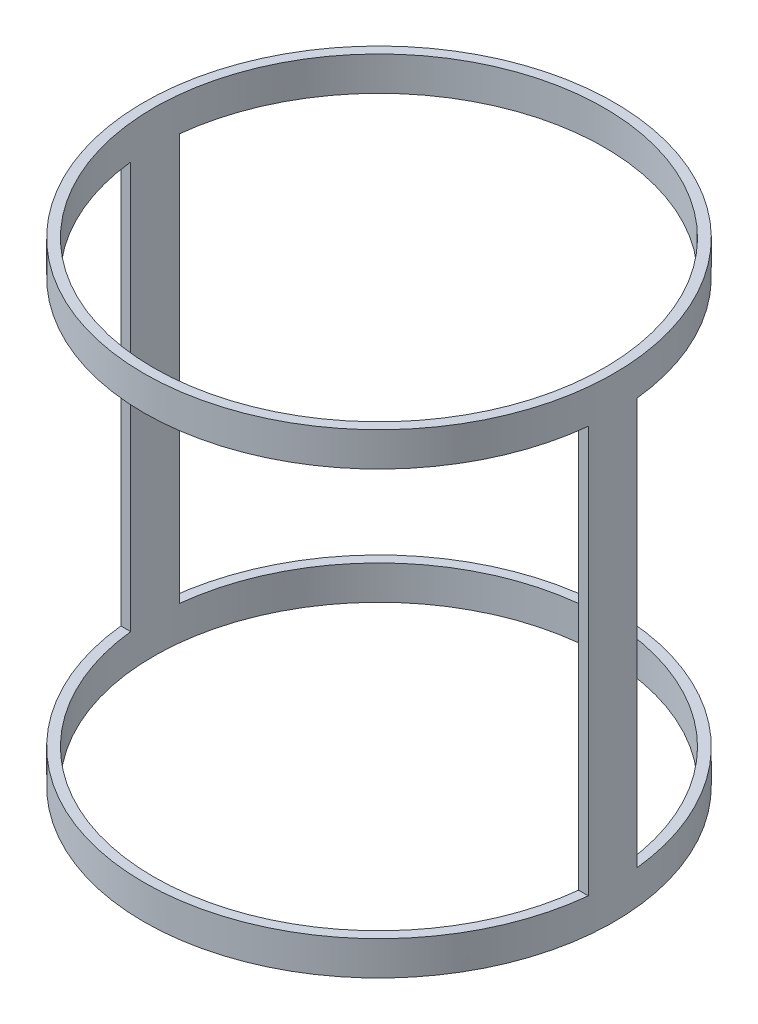
ISO-10303-21;
HEADER;
FILE_DESCRIPTION(('STEP AP214'),'2;1');
FILE_NAME('part.step','',(''),(''),'','','');
FILE_SCHEMA(('AUTOMOTIVE_DESIGN { 1 0 10303 214 1 1 1 1 }'));
ENDSEC;
DATA;
#1=APPLICATION_CONTEXT('core data for automotive mechanical design processes');
#2=APPLICATION_PROTOCOL_DEFINITION('international standard','automotive_design',2000,#1);
#3=PRODUCT_CONTEXT('',#1,'mechanical');
#4=PRODUCT('Part','Part','',(#3));
#5=PRODUCT_RELATED_PRODUCT_CATEGORY('part','',(#4));
#6=PRODUCT_DEFINITION_FORMATION('','',#4);
#7=PRODUCT_DEFINITION_CONTEXT('part definition',#1,'design');
#8=PRODUCT_DEFINITION('design','',#6,#7);
#9=PRODUCT_DEFINITION_SHAPE('','',#8);
#10=(LENGTH_UNIT() NAMED_UNIT(*) SI_UNIT(.MILLI.,.METRE.));
#11=(NAMED_UNIT(*) PLANE_ANGLE_UNIT() SI_UNIT($,.RADIAN.));
#12=(NAMED_UNIT(*) SI_UNIT($,.STERADIAN.) SOLID_ANGLE_UNIT());
#13=UNCERTAINTY_MEASURE_WITH_UNIT(LENGTH_MEASURE(1.E-05),#10,'distance_accuracy_value','');
#14=(GEOMETRIC_REPRESENTATION_CONTEXT(3) GLOBAL_UNCERTAINTY_ASSIGNED_CONTEXT((#13)) GLOBAL_UNIT_ASSIGNED_CONTEXT((#10,
#11,#12)) REPRESENTATION_CONTEXT('',''));
#15=CARTESIAN_POINT('',(0.,0.,0.));
#16=DIRECTION('',(0.,0.,1.));
#17=DIRECTION('',(1.,0.,0.));
#18=AXIS2_PLACEMENT_3D('',#15,#16,#17);
#19=CARTESIAN_POINT('',(-45.9789353943738,97.5,5.00000000000001));
#20=DIRECTION('',(0.,0.,-1.));
#21=DIRECTION('',(-1.,0.,0.));
#22=AXIS2_PLACEMENT_3D('',#19,#20,#21);
#23=PLANE('',#22);
#24=DIRECTION('',(1.,0.,0.));
#25=VECTOR('',#24,1.);
#26=CARTESIAN_POINT('',(-45.9789353943738,90.5,5.00000000000001));
#27=LINE('',#26,#25);
#28=CARTESIAN_POINT('',(-47.9902333813871,90.5,5.00000000000001));
#29=VERTEX_POINT('',#28);
#30=CARTESIAN_POINT('',(-45.9789353943738,90.5,5.00000000000001));
#31=VERTEX_POINT('',#30);
#32=EDGE_CURVE('E118',#29,#31,#27,.T.);
#33=ORIENTED_EDGE('',*,*,#32,.F.);
#34=DIRECTION('',(0.,-1.,0.));
#35=VECTOR('',#34,1.);
#36=CARTESIAN_POINT('',(-47.9902333813871,97.5,5.00000000000001));
#37=LINE('',#36,#35);
#38=CARTESIAN_POINT('',(-47.9902333813871,7.,5.00000000000001));
#39=VERTEX_POINT('',#38);
#40=EDGE_CURVE('E163',#29,#39,#37,.T.);
#41=ORIENTED_EDGE('',*,*,#40,.T.);
#42=DIRECTION('',(1.,0.,0.));
#43=VECTOR('',#42,1.);
#44=CARTESIAN_POINT('',(-45.9789353943738,7.00000000000001,5.00000000000001));
#45=LINE('',#44,#43);
#46=CARTESIAN_POINT('',(-45.9789353943738,7.,5.00000000000001));
#47=VERTEX_POINT('',#46);
#48=EDGE_CURVE('E143',#39,#47,#45,.T.);
#49=ORIENTED_EDGE('',*,*,#48,.T.);
#50=DIRECTION('',(0.,-1.,0.));
#51=VECTOR('',#50,1.);
#52=CARTESIAN_POINT('',(-45.9789353943738,97.5,5.00000000000001));
#53=LINE('',#52,#51);
#54=EDGE_CURVE('E161',#31,#47,#53,.T.);
#55=ORIENTED_EDGE('',*,*,#54,.F.);
#56=EDGE_LOOP('',(#33,#41,#49,#55));
#57=FACE_BOUND('',#56,.T.);
#58=ADVANCED_FACE('F37',(#57),#23,.F.);
#59=CARTESIAN_POINT('',(-47.9902333813871,97.5,-5.));
#60=DIRECTION('',(0.,0.,1.));
#61=DIRECTION('',(1.,0.,0.));
#62=AXIS2_PLACEMENT_3D('',#59,#60,#61);
#63=PLANE('',#62);
#64=DIRECTION('',(-1.,0.,0.));
#65=VECTOR('',#64,1.);
#66=CARTESIAN_POINT('',(-47.9902333813871,90.5,-5.));
#67=LINE('',#66,#65);
#68=CARTESIAN_POINT('',(-45.9789353943738,90.5,-5.));
#69=VERTEX_POINT('',#68);
#70=CARTESIAN_POINT('',(-47.9902333813871,90.5,-5.));
#71=VERTEX_POINT('',#70);
#72=EDGE_CURVE('E130',#69,#71,#67,.T.);
#73=ORIENTED_EDGE('',*,*,#72,.F.);
#74=DIRECTION('',(0.,-1.,0.));
#75=VECTOR('',#74,1.);
#76=CARTESIAN_POINT('',(-45.9789353943738,97.5,-5.00000000000001));
#77=LINE('',#76,#75);
#78=CARTESIAN_POINT('',(-45.9789353943738,7.00000000000001,-5.00000000000001));
#79=VERTEX_POINT('',#78);
#80=EDGE_CURVE('E159',#69,#79,#77,.T.);
#81=ORIENTED_EDGE('',*,*,#80,.T.);
#82=DIRECTION('',(-1.,0.,0.));
#83=VECTOR('',#82,1.);
#84=CARTESIAN_POINT('',(-47.9902333813871,7.00000000000001,-5.));
#85=LINE('',#84,#83);
#86=CARTESIAN_POINT('',(-47.9902333813871,7.00000000000001,-5.));
#87=VERTEX_POINT('',#86);
#88=EDGE_CURVE('E165',#79,#87,#85,.T.);
#89=ORIENTED_EDGE('',*,*,#88,.T.);
#90=DIRECTION('',(0.,-1.,0.));
#91=VECTOR('',#90,1.);
#92=CARTESIAN_POINT('',(-47.9902333813871,97.5,-5.));
#93=LINE('',#92,#91);
#94=EDGE_CURVE('E60',#71,#87,#93,.T.);
#95=ORIENTED_EDGE('',*,*,#94,.F.);
#96=EDGE_LOOP('',(#73,#81,#89,#95));
#97=FACE_BOUND('',#96,.T.);
#98=ADVANCED_FACE('F188',(#97),#63,.F.);
#99=CARTESIAN_POINT('',(45.9789353943738,97.5,-5.));
#100=DIRECTION('',(0.,0.,1.));
#101=DIRECTION('',(1.,0.,0.));
#102=AXIS2_PLACEMENT_3D('',#99,#100,#101);
#103=PLANE('',#102);
#104=DIRECTION('',(-1.,0.,0.));
#105=VECTOR('',#104,1.);
#106=CARTESIAN_POINT('',(45.9789353943738,90.5,-5.));
#107=LINE('',#106,#105);
#108=CARTESIAN_POINT('',(47.9902333813871,90.5,-5.));
#109=VERTEX_POINT('',#108);
#110=CARTESIAN_POINT('',(45.9789353943738,90.5,-5.));
#111=VERTEX_POINT('',#110);
#112=EDGE_CURVE('E127',#109,#111,#107,.T.);
#113=ORIENTED_EDGE('',*,*,#112,.F.);
#114=DIRECTION('',(0.,-1.,0.));
#115=VECTOR('',#114,1.);
#116=CARTESIAN_POINT('',(47.9902333813871,97.5,-5.));
#117=LINE('',#116,#115);
#118=CARTESIAN_POINT('',(47.9902333813871,7.00000000000001,-5.));
#119=VERTEX_POINT('',#118);
#120=EDGE_CURVE('E133',#109,#119,#117,.T.);
#121=ORIENTED_EDGE('',*,*,#120,.T.);
#122=DIRECTION('',(1.,0.,0.));
#123=VECTOR('',#122,1.);
#124=CARTESIAN_POINT('',(0.,7.,-5.));
#125=LINE('',#124,#123);
#126=CARTESIAN_POINT('',(45.9789353943738,7.00000000000001,-5.));
#127=VERTEX_POINT('',#126);
#128=EDGE_CURVE('E45',#127,#119,#125,.T.);
#129=ORIENTED_EDGE('',*,*,#128,.F.);
#130=DIRECTION('',(0.,-1.,0.));
#131=VECTOR('',#130,1.);
#132=CARTESIAN_POINT('',(45.9789353943738,97.5,-5.));
#133=LINE('',#132,#131);
#134=EDGE_CURVE('E111',#111,#127,#133,.T.);
#135=ORIENTED_EDGE('',*,*,#134,.F.);
#136=EDGE_LOOP('',(#113,#121,#129,#135));
#137=FACE_BOUND('',#136,.T.);
#138=ADVANCED_FACE('F186',(#137),#103,.F.);
#139=CARTESIAN_POINT('',(47.9902333813871,97.5,4.99999999999999));
#140=DIRECTION('',(0.,0.,-1.));
#141=DIRECTION('',(-1.,0.,0.));
#142=AXIS2_PLACEMENT_3D('',#139,#140,#141);
#143=PLANE('',#142);
#144=DIRECTION('',(1.,0.,0.));
#145=VECTOR('',#144,1.);
#146=CARTESIAN_POINT('',(47.9902333813871,90.5,4.99999999999999));
#147=LINE('',#146,#145);
#148=CARTESIAN_POINT('',(45.9789353943738,90.5,4.99999999999999));
#149=VERTEX_POINT('',#148);
#150=CARTESIAN_POINT('',(47.9902333813871,90.5,4.99999999999999));
#151=VERTEX_POINT('',#150);
#152=EDGE_CURVE('E11',#149,#151,#147,.T.);
#153=ORIENTED_EDGE('',*,*,#152,.F.);
#154=DIRECTION('',(0.,-1.,0.));
#155=VECTOR('',#154,1.);
#156=CARTESIAN_POINT('',(45.9789353943738,97.5,5.));
#157=LINE('',#156,#155);
#158=CARTESIAN_POINT('',(45.9789353943738,7.,4.99999999999999));
#159=VERTEX_POINT('',#158);
#160=EDGE_CURVE('E101',#149,#159,#157,.T.);
#161=ORIENTED_EDGE('',*,*,#160,.T.);
#162=DIRECTION('',(-1.,0.,0.));
#163=VECTOR('',#162,1.);
#164=CARTESIAN_POINT('',(0.,7.,4.99999999999999));
#165=LINE('',#164,#163);
#166=CARTESIAN_POINT('',(47.9902333813871,7.00000000000001,4.99999999999999));
#167=VERTEX_POINT('',#166);
#168=EDGE_CURVE('E167',#167,#159,#165,.T.);
#169=ORIENTED_EDGE('',*,*,#168,.F.);
#170=DIRECTION('',(0.,-1.,0.));
#171=VECTOR('',#170,1.);
#172=CARTESIAN_POINT('',(47.9902333813871,97.5,4.99999999999999));
#173=LINE('',#172,#171);
#174=EDGE_CURVE('E110',#151,#167,#173,.T.);
#175=ORIENTED_EDGE('',*,*,#174,.F.);
#176=EDGE_LOOP('',(#153,#161,#169,#175));
#177=FACE_BOUND('',#176,.T.);
#178=ADVANCED_FACE('F113',(#177),#143,.F.);
#179=CARTESIAN_POINT('',(0.,7.,0.));
#180=DIRECTION('',(0.,1.,0.));
#181=DIRECTION('',(0.,0.,1.));
#182=AXIS2_PLACEMENT_3D('',#179,#180,#181);
#183=PLANE('',#182);
#184=CARTESIAN_POINT('',(0.,7.,0.));
#185=DIRECTION('',(0.,1.,0.));
#186=DIRECTION('',(0.,0.,1.));
#187=AXIS2_PLACEMENT_3D('',#184,#185,#186);
#188=CIRCLE('',#187,46.25);
#189=EDGE_CURVE('E137',#127,#79,#188,.T.);
#190=ORIENTED_EDGE('',*,*,#189,.F.);
#191=ORIENTED_EDGE('',*,*,#128,.T.);
#192=CARTESIAN_POINT('',(0.,7.,0.));
#193=DIRECTION('',(0.,1.,0.));
#194=DIRECTION('',(0.,0.,1.));
#195=AXIS2_PLACEMENT_3D('',#192,#193,#194);
#196=CIRCLE('',#195,48.25);
#197=EDGE_CURVE('E139',#119,#87,#196,.T.);
#198=ORIENTED_EDGE('',*,*,#197,.T.);
#199=ORIENTED_EDGE('',*,*,#88,.F.);
#200=EDGE_LOOP('',(#190,#191,#198,#199));
#201=FACE_BOUND('',#200,.T.);
#202=ADVANCED_FACE('F174',(#201),#183,.T.);
#203=EDGE_CURVE('E140',#39,#167,#196,.T.);
#204=ORIENTED_EDGE('',*,*,#203,.T.);
#205=ORIENTED_EDGE('',*,*,#168,.T.);
#206=EDGE_CURVE('E106',#47,#159,#188,.T.);
#207=ORIENTED_EDGE('',*,*,#206,.F.);
#208=ORIENTED_EDGE('',*,*,#48,.F.);
#209=EDGE_LOOP('',(#204,#205,#207,#208));
#210=FACE_BOUND('',#209,.T.);
#211=ADVANCED_FACE('F208',(#210),#183,.T.);
#212=CARTESIAN_POINT('',(0.,97.5,0.));
#213=DIRECTION('',(0.,-1.,0.));
#214=DIRECTION('',(0.,0.,-1.));
#215=AXIS2_PLACEMENT_3D('',#212,#213,#214);
#216=CYLINDRICAL_SURFACE('',#215,48.25);
#217=ORIENTED_EDGE('',*,*,#120,.F.);
#218=CARTESIAN_POINT('',(0.,90.5,0.));
#219=DIRECTION('',(0.,1.,0.));
#220=DIRECTION('',(0.,0.,1.));
#221=AXIS2_PLACEMENT_3D('',#218,#219,#220);
#222=CIRCLE('',#221,48.25);
#223=EDGE_CURVE('E126',#109,#71,#222,.T.);
#224=ORIENTED_EDGE('',*,*,#223,.T.);
#225=ORIENTED_EDGE('',*,*,#94,.T.);
#226=ORIENTED_EDGE('',*,*,#197,.F.);
#227=EDGE_LOOP('',(#217,#224,#225,#226));
#228=FACE_BOUND('',#227,.T.);
#229=EDGE_CURVE('E123',#29,#151,#222,.T.);
#230=ORIENTED_EDGE('',*,*,#229,.T.);
#231=ORIENTED_EDGE('',*,*,#174,.T.);
#232=ORIENTED_EDGE('',*,*,#203,.F.);
#233=ORIENTED_EDGE('',*,*,#40,.F.);
#234=EDGE_LOOP('',(#230,#231,#232,#233));
#235=FACE_BOUND('',#234,.T.);
#236=CARTESIAN_POINT('',(0.,97.5,0.));
#237=DIRECTION('',(0.,1.,0.));
#238=DIRECTION('',(0.,0.,1.));
#239=AXIS2_PLACEMENT_3D('',#236,#237,#238);
#240=CIRCLE('',#239,48.25);
#241=CARTESIAN_POINT('',(0.,97.5,48.25));
#242=VERTEX_POINT('',#241);
#243=EDGE_CURVE('E147',#242,#242,#240,.T.);
#244=ORIENTED_EDGE('',*,*,#243,.F.);
#245=EDGE_LOOP('',(#244));
#246=FACE_BOUND('',#245,.T.);
#247=CARTESIAN_POINT('',(0.,0.,0.));
#248=DIRECTION('',(0.,1.,0.));
#249=DIRECTION('',(0.,0.,1.));
#250=AXIS2_PLACEMENT_3D('',#247,#248,#249);
#251=CIRCLE('',#250,48.25);
#252=CARTESIAN_POINT('',(0.,0.,48.25));
#253=VERTEX_POINT('',#252);
#254=EDGE_CURVE('E146',#253,#253,#251,.T.);
#255=ORIENTED_EDGE('',*,*,#254,.T.);
#256=EDGE_LOOP('',(#255));
#257=FACE_BOUND('',#256,.T.);
#258=ADVANCED_FACE('F39',(#228,#235,#246,#257),#216,.T.);
#259=CARTESIAN_POINT('',(0.,97.5,0.));
#260=DIRECTION('',(0.,-1.,0.));
#261=DIRECTION('',(0.,0.,-1.));
#262=AXIS2_PLACEMENT_3D('',#259,#260,#261);
#263=CYLINDRICAL_SURFACE('',#262,46.25);
#264=CARTESIAN_POINT('',(0.,90.5,0.));
#265=DIRECTION('',(0.,1.,0.));
#266=DIRECTION('',(0.,0.,1.));
#267=AXIS2_PLACEMENT_3D('',#264,#265,#266);
#268=CIRCLE('',#267,46.25);
#269=EDGE_CURVE('E52',#31,#149,#268,.T.);
#270=ORIENTED_EDGE('',*,*,#269,.F.);
#271=ORIENTED_EDGE('',*,*,#54,.T.);
#272=ORIENTED_EDGE('',*,*,#206,.T.);
#273=ORIENTED_EDGE('',*,*,#160,.F.);
#274=EDGE_LOOP('',(#270,#271,#272,#273));
#275=FACE_BOUND('',#274,.T.);
#276=ORIENTED_EDGE('',*,*,#80,.F.);
#277=EDGE_CURVE('E120',#111,#69,#268,.T.);
#278=ORIENTED_EDGE('',*,*,#277,.F.);
#279=ORIENTED_EDGE('',*,*,#134,.T.);
#280=ORIENTED_EDGE('',*,*,#189,.T.);
#281=EDGE_LOOP('',(#276,#278,#279,#280));
#282=FACE_BOUND('',#281,.T.);
#283=CARTESIAN_POINT('',(0.,97.5,0.));
#284=DIRECTION('',(0.,-1.,0.));
#285=DIRECTION('',(0.,0.,1.));
#286=AXIS2_PLACEMENT_3D('',#283,#284,#285);
#287=CIRCLE('',#286,46.25);
#288=CARTESIAN_POINT('',(0.,97.5,46.25));
#289=VERTEX_POINT('',#288);
#290=EDGE_CURVE('E150',#289,#289,#287,.T.);
#291=ORIENTED_EDGE('',*,*,#290,.F.);
#292=EDGE_LOOP('',(#291));
#293=FACE_BOUND('',#292,.T.);
#294=CARTESIAN_POINT('',(0.,0.,0.));
#295=DIRECTION('',(0.,-1.,0.));
#296=DIRECTION('',(0.,0.,1.));
#297=AXIS2_PLACEMENT_3D('',#294,#295,#296);
#298=CIRCLE('',#297,46.25);
#299=CARTESIAN_POINT('',(0.,0.,46.25));
#300=VERTEX_POINT('',#299);
#301=EDGE_CURVE('E151',#300,#300,#298,.T.);
#302=ORIENTED_EDGE('',*,*,#301,.T.);
#303=EDGE_LOOP('',(#302));
#304=FACE_BOUND('',#303,.T.);
#305=ADVANCED_FACE('F103',(#275,#282,#293,#304),#263,.F.);
#306=CARTESIAN_POINT('',(0.,97.5,0.));
#307=DIRECTION('',(0.,1.,0.));
#308=DIRECTION('',(0.,0.,1.));
#309=AXIS2_PLACEMENT_3D('',#306,#307,#308);
#310=PLANE('',#309);
#311=ORIENTED_EDGE('',*,*,#290,.T.);
#312=EDGE_LOOP('',(#311));
#313=FACE_BOUND('',#312,.T.);
#314=ORIENTED_EDGE('',*,*,#243,.T.);
#315=EDGE_LOOP('',(#314));
#316=FACE_BOUND('',#315,.T.);
#317=ADVANCED_FACE('F202',(#313,#316),#310,.T.);
#318=CARTESIAN_POINT('',(0.,0.,0.));
#319=DIRECTION('',(0.,1.,0.));
#320=DIRECTION('',(0.,0.,1.));
#321=AXIS2_PLACEMENT_3D('',#318,#319,#320);
#322=PLANE('',#321);
#323=ORIENTED_EDGE('',*,*,#254,.F.);
#324=EDGE_LOOP('',(#323));
#325=FACE_BOUND('',#324,.T.);
#326=ORIENTED_EDGE('',*,*,#301,.F.);
#327=EDGE_LOOP('',(#326));
#328=FACE_BOUND('',#327,.T.);
#329=ADVANCED_FACE('F199',(#325,#328),#322,.F.);
#330=CARTESIAN_POINT('',(0.,90.5,0.));
#331=DIRECTION('',(0.,1.,0.));
#332=DIRECTION('',(0.,0.,1.));
#333=AXIS2_PLACEMENT_3D('',#330,#331,#332);
#334=PLANE('',#333);
#335=ORIENTED_EDGE('',*,*,#229,.F.);
#336=ORIENTED_EDGE('',*,*,#32,.T.);
#337=ORIENTED_EDGE('',*,*,#269,.T.);
#338=ORIENTED_EDGE('',*,*,#152,.T.);
#339=EDGE_LOOP('',(#335,#336,#337,#338));
#340=FACE_BOUND('',#339,.T.);
#341=ADVANCED_FACE('F116',(#340),#334,.F.);
#342=ORIENTED_EDGE('',*,*,#277,.T.);
#343=ORIENTED_EDGE('',*,*,#72,.T.);
#344=ORIENTED_EDGE('',*,*,#223,.F.);
#345=ORIENTED_EDGE('',*,*,#112,.T.);
#346=EDGE_LOOP('',(#342,#343,#344,#345));
#347=FACE_BOUND('',#346,.T.);
#348=ADVANCED_FACE('F185',(#347),#334,.F.);
#349=CLOSED_SHELL('',(#58,#98,#138,#178,#202,#211,#258,#305,#317,#329,#341,#348));
#350=MANIFOLD_SOLID_BREP('B2',#349);
#351=ADVANCED_BREP_SHAPE_REPRESENTATION('',(#18,#350),#14);
#352=SHAPE_DEFINITION_REPRESENTATION(#9,#351);
ENDSEC;
END-ISO-10303-21;
